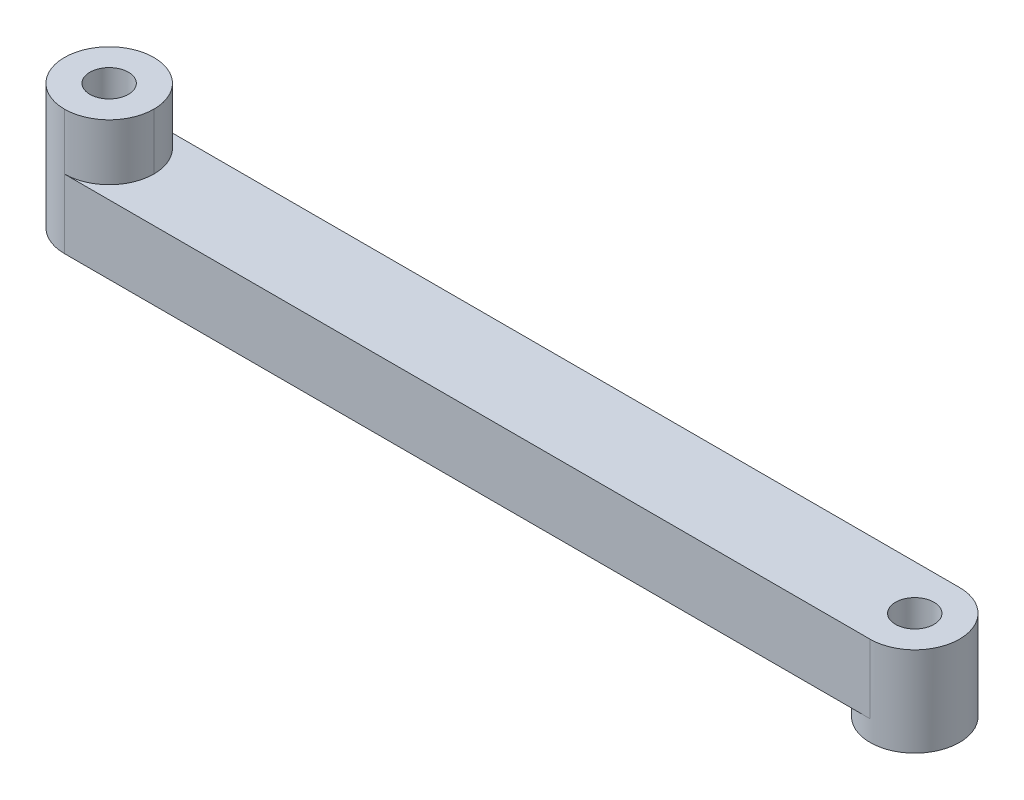
ISO-10303-21;
HEADER;
FILE_DESCRIPTION(('STEP AP214'),'2;1');
FILE_NAME('part.step','',(''),(''),'','','');
FILE_SCHEMA(('AUTOMOTIVE_DESIGN { 1 0 10303 214 1 1 1 1 }'));
ENDSEC;
DATA;
#1=APPLICATION_CONTEXT('core data for automotive mechanical design processes');
#2=APPLICATION_PROTOCOL_DEFINITION('international standard','automotive_design',2000,#1);
#3=PRODUCT_CONTEXT('',#1,'mechanical');
#4=PRODUCT('Part','Part','',(#3));
#5=PRODUCT_RELATED_PRODUCT_CATEGORY('part','',(#4));
#6=PRODUCT_DEFINITION_FORMATION('','',#4);
#7=PRODUCT_DEFINITION_CONTEXT('part definition',#1,'design');
#8=PRODUCT_DEFINITION('design','',#6,#7);
#9=PRODUCT_DEFINITION_SHAPE('','',#8);
#10=(LENGTH_UNIT() NAMED_UNIT(*) SI_UNIT(.MILLI.,.METRE.));
#11=(NAMED_UNIT(*) PLANE_ANGLE_UNIT() SI_UNIT($,.RADIAN.));
#12=(NAMED_UNIT(*) SI_UNIT($,.STERADIAN.) SOLID_ANGLE_UNIT());
#13=UNCERTAINTY_MEASURE_WITH_UNIT(LENGTH_MEASURE(1.E-05),#10,'distance_accuracy_value','');
#14=(GEOMETRIC_REPRESENTATION_CONTEXT(3) GLOBAL_UNCERTAINTY_ASSIGNED_CONTEXT((#13)) GLOBAL_UNIT_ASSIGNED_CONTEXT((#10,
#11,#12)) REPRESENTATION_CONTEXT('',''));
#15=CARTESIAN_POINT('',(0.,0.,0.));
#16=DIRECTION('',(0.,0.,1.));
#17=DIRECTION('',(1.,0.,0.));
#18=AXIS2_PLACEMENT_3D('',#15,#16,#17);
#19=CARTESIAN_POINT('',(-50.,3.85,10.));
#20=DIRECTION('',(0.,-1.,0.));
#21=DIRECTION('',(0.,0.,-1.));
#22=AXIS2_PLACEMENT_3D('',#19,#20,#21);
#23=PLANE('',#22);
#24=CARTESIAN_POINT('',(45.,3.85,5.));
#25=DIRECTION('',(0.,-1.,0.));
#26=DIRECTION('',(0.,0.,-1.));
#27=AXIS2_PLACEMENT_3D('',#24,#25,#26);
#28=CIRCLE('',#27,2.15);
#29=CARTESIAN_POINT('',(45.,3.85,2.85));
#30=VERTEX_POINT('',#29);
#31=EDGE_CURVE('E174',#30,#30,#28,.T.);
#32=ORIENTED_EDGE('',*,*,#31,.T.);
#33=EDGE_LOOP('',(#32));
#34=FACE_BOUND('',#33,.T.);
#35=DIRECTION('',(-1.,0.,0.));
#36=VECTOR('',#35,1.);
#37=CARTESIAN_POINT('',(-50.,3.85,10.));
#38=LINE('',#37,#36);
#39=CARTESIAN_POINT('',(45.,3.85,10.));
#40=VERTEX_POINT('',#39);
#41=CARTESIAN_POINT('',(-45.,3.85,10.));
#42=VERTEX_POINT('',#41);
#43=EDGE_CURVE('E116',#40,#42,#38,.T.);
#44=ORIENTED_EDGE('',*,*,#43,.F.);
#45=CARTESIAN_POINT('',(45.,3.85,5.));
#46=DIRECTION('',(0.,-1.,0.));
#47=DIRECTION('',(0.,0.,-1.));
#48=AXIS2_PLACEMENT_3D('',#45,#46,#47);
#49=CIRCLE('',#48,5.);
#50=CARTESIAN_POINT('',(50.,3.85,5.));
#51=VERTEX_POINT('',#50);
#52=EDGE_CURVE('E133',#40,#51,#49,.F.);
#53=ORIENTED_EDGE('',*,*,#52,.T.);
#54=CARTESIAN_POINT('',(45.,3.85,5.));
#55=DIRECTION('',(0.,-1.,0.));
#56=DIRECTION('',(0.,0.,-1.));
#57=AXIS2_PLACEMENT_3D('',#54,#55,#56);
#58=CIRCLE('',#57,5.);
#59=CARTESIAN_POINT('',(45.,3.85,0.));
#60=VERTEX_POINT('',#59);
#61=EDGE_CURVE('E125',#51,#60,#58,.F.);
#62=ORIENTED_EDGE('',*,*,#61,.T.);
#63=DIRECTION('',(-1.,0.,0.));
#64=VECTOR('',#63,1.);
#65=CARTESIAN_POINT('',(-50.,3.85,0.));
#66=LINE('',#65,#64);
#67=CARTESIAN_POINT('',(-45.,3.85,0.));
#68=VERTEX_POINT('',#67);
#69=EDGE_CURVE('E117',#60,#68,#66,.T.);
#70=ORIENTED_EDGE('',*,*,#69,.T.);
#71=CARTESIAN_POINT('',(-45.,3.85,5.));
#72=DIRECTION('',(0.,-1.,0.));
#73=DIRECTION('',(0.,0.,-1.));
#74=AXIS2_PLACEMENT_3D('',#71,#72,#73);
#75=CIRCLE('',#74,5.);
#76=CARTESIAN_POINT('',(-40.,3.85,5.));
#77=VERTEX_POINT('',#76);
#78=EDGE_CURVE('E50',#68,#77,#75,.T.);
#79=ORIENTED_EDGE('',*,*,#78,.T.);
#80=CARTESIAN_POINT('',(-45.,3.85,5.));
#81=DIRECTION('',(0.,-1.,0.));
#82=DIRECTION('',(0.,0.,-1.));
#83=AXIS2_PLACEMENT_3D('',#80,#81,#82);
#84=CIRCLE('',#83,5.);
#85=EDGE_CURVE('E155',#77,#42,#84,.T.);
#86=ORIENTED_EDGE('',*,*,#85,.T.);
#87=EDGE_LOOP('',(#44,#53,#62,#70,#79,#86));
#88=FACE_BOUND('',#87,.T.);
#89=ADVANCED_FACE('F41',(#34,#88),#23,.F.);
#90=CARTESIAN_POINT('',(-50.,-3.85,10.));
#91=DIRECTION('',(0.,1.,0.));
#92=DIRECTION('',(0.,0.,1.));
#93=AXIS2_PLACEMENT_3D('',#90,#91,#92);
#94=PLANE('',#93);
#95=CARTESIAN_POINT('',(45.,-3.85,5.));
#96=DIRECTION('',(0.,-1.,0.));
#97=DIRECTION('',(0.,0.,-1.));
#98=AXIS2_PLACEMENT_3D('',#95,#96,#97);
#99=CIRCLE('',#98,5.);
#100=CARTESIAN_POINT('',(45.,-3.85,10.));
#101=VERTEX_POINT('',#100);
#102=CARTESIAN_POINT('',(45.,-3.85,0.));
#103=VERTEX_POINT('',#102);
#104=EDGE_CURVE('E11',#101,#103,#99,.T.);
#105=ORIENTED_EDGE('',*,*,#104,.F.);
#106=DIRECTION('',(1.,0.,0.));
#107=VECTOR('',#106,1.);
#108=CARTESIAN_POINT('',(-50.,-3.85,10.));
#109=LINE('',#108,#107);
#110=CARTESIAN_POINT('',(-45.,-3.85,10.));
#111=VERTEX_POINT('',#110);
#112=EDGE_CURVE('E141',#111,#101,#109,.T.);
#113=ORIENTED_EDGE('',*,*,#112,.F.);
#114=CARTESIAN_POINT('',(-45.,-3.85,5.));
#115=DIRECTION('',(0.,1.,0.));
#116=DIRECTION('',(0.,0.,1.));
#117=AXIS2_PLACEMENT_3D('',#114,#115,#116);
#118=CIRCLE('',#117,5.);
#119=CARTESIAN_POINT('',(-50.,-3.85,5.));
#120=VERTEX_POINT('',#119);
#121=EDGE_CURVE('E65',#111,#120,#118,.F.);
#122=ORIENTED_EDGE('',*,*,#121,.T.);
#123=CARTESIAN_POINT('',(-45.,-3.85,5.));
#124=DIRECTION('',(0.,1.,0.));
#125=DIRECTION('',(0.,0.,1.));
#126=AXIS2_PLACEMENT_3D('',#123,#124,#125);
#127=CIRCLE('',#126,5.);
#128=CARTESIAN_POINT('',(-45.,-3.85,0.));
#129=VERTEX_POINT('',#128);
#130=EDGE_CURVE('E112',#120,#129,#127,.F.);
#131=ORIENTED_EDGE('',*,*,#130,.T.);
#132=DIRECTION('',(1.,0.,0.));
#133=VECTOR('',#132,1.);
#134=CARTESIAN_POINT('',(-50.,-3.85,0.));
#135=LINE('',#134,#133);
#136=EDGE_CURVE('E107',#129,#103,#135,.T.);
#137=ORIENTED_EDGE('',*,*,#136,.T.);
#138=EDGE_LOOP('',(#105,#113,#122,#131,#137));
#139=FACE_BOUND('',#138,.T.);
#140=CARTESIAN_POINT('',(-45.,-3.85,5.));
#141=DIRECTION('',(0.,1.,0.));
#142=DIRECTION('',(0.,0.,1.));
#143=AXIS2_PLACEMENT_3D('',#140,#141,#142);
#144=CIRCLE('',#143,2.15);
#145=CARTESIAN_POINT('',(-45.,-3.85,7.15));
#146=VERTEX_POINT('',#145);
#147=EDGE_CURVE('E177',#146,#146,#144,.T.);
#148=ORIENTED_EDGE('',*,*,#147,.T.);
#149=EDGE_LOOP('',(#148));
#150=FACE_BOUND('',#149,.T.);
#151=ADVANCED_FACE('F109',(#139,#150),#94,.F.);
#152=CARTESIAN_POINT('',(0.,0.,10.));
#153=DIRECTION('',(0.,0.,-1.));
#154=DIRECTION('',(-1.,0.,0.));
#155=AXIS2_PLACEMENT_3D('',#152,#153,#154);
#156=PLANE('',#155);
#157=ORIENTED_EDGE('',*,*,#112,.T.);
#158=DIRECTION('',(0.,1.,0.));
#159=VECTOR('',#158,1.);
#160=CARTESIAN_POINT('',(45.,0.,10.));
#161=LINE('',#160,#159);
#162=EDGE_CURVE('E131',#101,#40,#161,.T.);
#163=ORIENTED_EDGE('',*,*,#162,.T.);
#164=ORIENTED_EDGE('',*,*,#43,.T.);
#165=DIRECTION('',(0.,-1.,0.));
#166=VECTOR('',#165,1.);
#167=CARTESIAN_POINT('',(-45.,0.,10.));
#168=LINE('',#167,#166);
#169=EDGE_CURVE('E137',#42,#111,#168,.T.);
#170=ORIENTED_EDGE('',*,*,#169,.T.);
#171=EDGE_LOOP('',(#157,#163,#164,#170));
#172=FACE_BOUND('',#171,.T.);
#173=ADVANCED_FACE('F211',(#172),#156,.F.);
#174=CARTESIAN_POINT('',(0.,0.,0.));
#175=DIRECTION('',(0.,0.,-1.));
#176=DIRECTION('',(-1.,0.,0.));
#177=AXIS2_PLACEMENT_3D('',#174,#175,#176);
#178=PLANE('',#177);
#179=ORIENTED_EDGE('',*,*,#69,.F.);
#180=DIRECTION('',(0.,1.,0.));
#181=VECTOR('',#180,1.);
#182=CARTESIAN_POINT('',(45.,-3.85,0.));
#183=LINE('',#182,#181);
#184=EDGE_CURVE('E121',#60,#103,#183,.F.);
#185=ORIENTED_EDGE('',*,*,#184,.T.);
#186=ORIENTED_EDGE('',*,*,#136,.F.);
#187=DIRECTION('',(0.,-1.,0.));
#188=VECTOR('',#187,1.);
#189=CARTESIAN_POINT('',(-45.,10.13,0.));
#190=LINE('',#189,#188);
#191=EDGE_CURVE('E126',#129,#68,#190,.F.);
#192=ORIENTED_EDGE('',*,*,#191,.T.);
#193=EDGE_LOOP('',(#179,#185,#186,#192));
#194=FACE_BOUND('',#193,.T.);
#195=ADVANCED_FACE('F122',(#194),#178,.T.);
#196=CARTESIAN_POINT('',(0.,10.13,0.));
#197=DIRECTION('',(0.,-1.,0.));
#198=DIRECTION('',(0.,0.,-1.));
#199=AXIS2_PLACEMENT_3D('',#196,#197,#198);
#200=PLANE('',#199);
#201=CARTESIAN_POINT('',(-45.,10.13,5.));
#202=DIRECTION('',(0.,1.,0.));
#203=DIRECTION('',(0.,0.,1.));
#204=AXIS2_PLACEMENT_3D('',#201,#202,#203);
#205=CIRCLE('',#204,2.15);
#206=CARTESIAN_POINT('',(-45.,10.13,7.15));
#207=VERTEX_POINT('',#206);
#208=EDGE_CURVE('E178',#207,#207,#205,.T.);
#209=ORIENTED_EDGE('',*,*,#208,.F.);
#210=EDGE_LOOP('',(#209));
#211=FACE_BOUND('',#210,.T.);
#212=CARTESIAN_POINT('',(-45.,10.13,5.));
#213=DIRECTION('',(0.,-1.,0.));
#214=DIRECTION('',(0.,0.,-1.));
#215=AXIS2_PLACEMENT_3D('',#212,#213,#214);
#216=CIRCLE('',#215,5.);
#217=CARTESIAN_POINT('',(-50.,10.13,5.));
#218=VERTEX_POINT('',#217);
#219=CARTESIAN_POINT('',(-45.,10.13,10.));
#220=VERTEX_POINT('',#219);
#221=EDGE_CURVE('E136',#218,#220,#216,.F.);
#222=ORIENTED_EDGE('',*,*,#221,.T.);
#223=CARTESIAN_POINT('',(-45.,10.13,5.));
#224=DIRECTION('',(0.,-1.,0.));
#225=DIRECTION('',(0.,0.,-1.));
#226=AXIS2_PLACEMENT_3D('',#223,#224,#225);
#227=CIRCLE('',#226,5.);
#228=CARTESIAN_POINT('',(-40.,10.13,5.));
#229=VERTEX_POINT('',#228);
#230=EDGE_CURVE('E147',#220,#229,#227,.F.);
#231=ORIENTED_EDGE('',*,*,#230,.T.);
#232=CARTESIAN_POINT('',(-45.,10.13,5.));
#233=DIRECTION('',(0.,-1.,0.));
#234=DIRECTION('',(0.,0.,-1.));
#235=AXIS2_PLACEMENT_3D('',#232,#233,#234);
#236=CIRCLE('',#235,5.);
#237=CARTESIAN_POINT('',(-45.,10.13,0.));
#238=VERTEX_POINT('',#237);
#239=EDGE_CURVE('E145',#229,#238,#236,.F.);
#240=ORIENTED_EDGE('',*,*,#239,.T.);
#241=CARTESIAN_POINT('',(-45.,10.13,5.));
#242=DIRECTION('',(0.,-1.,0.));
#243=DIRECTION('',(0.,0.,-1.));
#244=AXIS2_PLACEMENT_3D('',#241,#242,#243);
#245=CIRCLE('',#244,5.);
#246=EDGE_CURVE('E139',#238,#218,#245,.F.);
#247=ORIENTED_EDGE('',*,*,#246,.T.);
#248=EDGE_LOOP('',(#222,#231,#240,#247));
#249=FACE_BOUND('',#248,.T.);
#250=ADVANCED_FACE('F226',(#211,#249),#200,.F.);
#251=CARTESIAN_POINT('',(-45.,-3.85,5.));
#252=DIRECTION('',(0.,1.,0.));
#253=DIRECTION('',(0.,0.,1.));
#254=AXIS2_PLACEMENT_3D('',#251,#252,#253);
#255=CYLINDRICAL_SURFACE('',#254,5.);
#256=ORIENTED_EDGE('',*,*,#191,.F.);
#257=ORIENTED_EDGE('',*,*,#130,.F.);
#258=DIRECTION('',(0.,-1.,0.));
#259=VECTOR('',#258,1.);
#260=CARTESIAN_POINT('',(-50.,-3.85,5.));
#261=LINE('',#260,#259);
#262=EDGE_CURVE('E165',#218,#120,#261,.T.);
#263=ORIENTED_EDGE('',*,*,#262,.F.);
#264=ORIENTED_EDGE('',*,*,#246,.F.);
#265=DIRECTION('',(0.,-1.,0.));
#266=VECTOR('',#265,1.);
#267=CARTESIAN_POINT('',(-45.,10.13,0.));
#268=LINE('',#267,#266);
#269=EDGE_CURVE('E163',#68,#238,#268,.F.);
#270=ORIENTED_EDGE('',*,*,#269,.F.);
#271=EDGE_LOOP('',(#256,#257,#263,#264,#270));
#272=FACE_BOUND('',#271,.T.);
#273=ADVANCED_FACE('F224',(#272),#255,.T.);
#274=CARTESIAN_POINT('',(-45.,0.,5.));
#275=DIRECTION('',(0.,-1.,0.));
#276=DIRECTION('',(0.,0.,-1.));
#277=AXIS2_PLACEMENT_3D('',#274,#275,#276);
#278=CYLINDRICAL_SURFACE('',#277,5.);
#279=ORIENTED_EDGE('',*,*,#121,.F.);
#280=ORIENTED_EDGE('',*,*,#169,.F.);
#281=DIRECTION('',(0.,-1.,0.));
#282=VECTOR('',#281,1.);
#283=CARTESIAN_POINT('',(-45.,0.,10.));
#284=LINE('',#283,#282);
#285=EDGE_CURVE('E160',#220,#42,#284,.T.);
#286=ORIENTED_EDGE('',*,*,#285,.F.);
#287=ORIENTED_EDGE('',*,*,#221,.F.);
#288=ORIENTED_EDGE('',*,*,#262,.T.);
#289=EDGE_LOOP('',(#279,#280,#286,#287,#288));
#290=FACE_BOUND('',#289,.T.);
#291=ADVANCED_FACE('F221',(#290),#278,.T.);
#292=CARTESIAN_POINT('',(-45.,0.,5.));
#293=DIRECTION('',(0.,1.,0.));
#294=DIRECTION('',(0.,0.,1.));
#295=AXIS2_PLACEMENT_3D('',#292,#293,#294);
#296=CYLINDRICAL_SURFACE('',#295,5.);
#297=ORIENTED_EDGE('',*,*,#269,.T.);
#298=ORIENTED_EDGE('',*,*,#239,.F.);
#299=DIRECTION('',(0.,-1.,0.));
#300=VECTOR('',#299,1.);
#301=CARTESIAN_POINT('',(-40.,10.13,5.));
#302=LINE('',#301,#300);
#303=EDGE_CURVE('E158',#77,#229,#302,.F.);
#304=ORIENTED_EDGE('',*,*,#303,.F.);
#305=ORIENTED_EDGE('',*,*,#78,.F.);
#306=EDGE_LOOP('',(#297,#298,#304,#305));
#307=FACE_BOUND('',#306,.T.);
#308=ADVANCED_FACE('F217',(#307),#296,.T.);
#309=CARTESIAN_POINT('',(-45.,10.13,5.));
#310=DIRECTION('',(0.,-1.,0.));
#311=DIRECTION('',(0.,0.,-1.));
#312=AXIS2_PLACEMENT_3D('',#309,#310,#311);
#313=CYLINDRICAL_SURFACE('',#312,5.);
#314=ORIENTED_EDGE('',*,*,#230,.F.);
#315=ORIENTED_EDGE('',*,*,#285,.T.);
#316=ORIENTED_EDGE('',*,*,#85,.F.);
#317=ORIENTED_EDGE('',*,*,#303,.T.);
#318=EDGE_LOOP('',(#314,#315,#316,#317));
#319=FACE_BOUND('',#318,.T.);
#320=ADVANCED_FACE('F215',(#319),#313,.T.);
#321=CARTESIAN_POINT('',(45.,-3.85,5.));
#322=DIRECTION('',(0.,-1.,0.));
#323=DIRECTION('',(0.,0.,-1.));
#324=AXIS2_PLACEMENT_3D('',#321,#322,#323);
#325=CYLINDRICAL_SURFACE('',#324,5.);
#326=DIRECTION('',(0.,1.,0.));
#327=VECTOR('',#326,1.);
#328=CARTESIAN_POINT('',(50.,3.85,5.));
#329=LINE('',#328,#327);
#330=CARTESIAN_POINT('',(50.,-3.85,5.));
#331=VERTEX_POINT('',#330);
#332=EDGE_CURVE('E45',#331,#51,#329,.T.);
#333=ORIENTED_EDGE('',*,*,#332,.F.);
#334=ORIENTED_EDGE('',*,*,#332,.T.);
#335=ORIENTED_EDGE('',*,*,#52,.F.);
#336=ORIENTED_EDGE('',*,*,#162,.F.);
#337=ORIENTED_EDGE('',*,*,#104,.T.);
#338=ORIENTED_EDGE('',*,*,#184,.F.);
#339=ORIENTED_EDGE('',*,*,#61,.F.);
#340=EDGE_LOOP('',(#333,#334,#335,#336,#337,#338,#339));
#341=FACE_BOUND('',#340,.T.);
#342=CARTESIAN_POINT('',(45.,-6.15,5.));
#343=DIRECTION('',(0.,-1.,0.));
#344=DIRECTION('',(0.,0.,-1.));
#345=AXIS2_PLACEMENT_3D('',#342,#343,#344);
#346=CIRCLE('',#345,5.);
#347=CARTESIAN_POINT('',(45.,-6.15,0.));
#348=VERTEX_POINT('',#347);
#349=EDGE_CURVE('E181',#348,#348,#346,.T.);
#350=ORIENTED_EDGE('',*,*,#349,.F.);
#351=EDGE_LOOP('',(#350));
#352=FACE_BOUND('',#351,.T.);
#353=ADVANCED_FACE('F43',(#341,#352),#325,.T.);
#354=CARTESIAN_POINT('',(-45.,-3.85,5.));
#355=DIRECTION('',(0.,1.,0.));
#356=DIRECTION('',(0.,0.,1.));
#357=AXIS2_PLACEMENT_3D('',#354,#355,#356);
#358=CYLINDRICAL_SURFACE('',#357,2.15);
#359=ORIENTED_EDGE('',*,*,#147,.F.);
#360=EDGE_LOOP('',(#359));
#361=FACE_BOUND('',#360,.T.);
#362=ORIENTED_EDGE('',*,*,#208,.T.);
#363=EDGE_LOOP('',(#362));
#364=FACE_BOUND('',#363,.T.);
#365=ADVANCED_FACE('F199',(#361,#364),#358,.F.);
#366=CARTESIAN_POINT('',(45.,-3.85,5.));
#367=DIRECTION('',(0.,1.,0.));
#368=DIRECTION('',(0.,0.,1.));
#369=AXIS2_PLACEMENT_3D('',#366,#367,#368);
#370=CYLINDRICAL_SURFACE('',#369,2.15);
#371=ORIENTED_EDGE('',*,*,#31,.F.);
#372=EDGE_LOOP('',(#371));
#373=FACE_BOUND('',#372,.T.);
#374=CARTESIAN_POINT('',(45.,-6.15,5.));
#375=DIRECTION('',(0.,-1.,0.));
#376=DIRECTION('',(0.,0.,-1.));
#377=AXIS2_PLACEMENT_3D('',#374,#375,#376);
#378=CIRCLE('',#377,2.15);
#379=CARTESIAN_POINT('',(45.,-6.15,2.85));
#380=VERTEX_POINT('',#379);
#381=EDGE_CURVE('E186',#380,#380,#378,.T.);
#382=ORIENTED_EDGE('',*,*,#381,.T.);
#383=EDGE_LOOP('',(#382));
#384=FACE_BOUND('',#383,.T.);
#385=ADVANCED_FACE('F190',(#373,#384),#370,.F.);
#386=CARTESIAN_POINT('',(45.,-6.15,5.));
#387=DIRECTION('',(0.,-1.,0.));
#388=DIRECTION('',(0.,0.,-1.));
#389=AXIS2_PLACEMENT_3D('',#386,#387,#388);
#390=PLANE('',#389);
#391=ORIENTED_EDGE('',*,*,#349,.T.);
#392=EDGE_LOOP('',(#391));
#393=FACE_BOUND('',#392,.T.);
#394=ORIENTED_EDGE('',*,*,#381,.F.);
#395=EDGE_LOOP('',(#394));
#396=FACE_BOUND('',#395,.T.);
#397=ADVANCED_FACE('F192',(#393,#396),#390,.T.);
#398=CLOSED_SHELL('',(#89,#151,#173,#195,#250,#273,#291,#308,#320,#353,#365,#385,#397));
#399=MANIFOLD_SOLID_BREP('B2',#398);
#400=ADVANCED_BREP_SHAPE_REPRESENTATION('',(#18,#399),#14);
#401=SHAPE_DEFINITION_REPRESENTATION(#9,#400);
ENDSEC;
END-ISO-10303-21;
